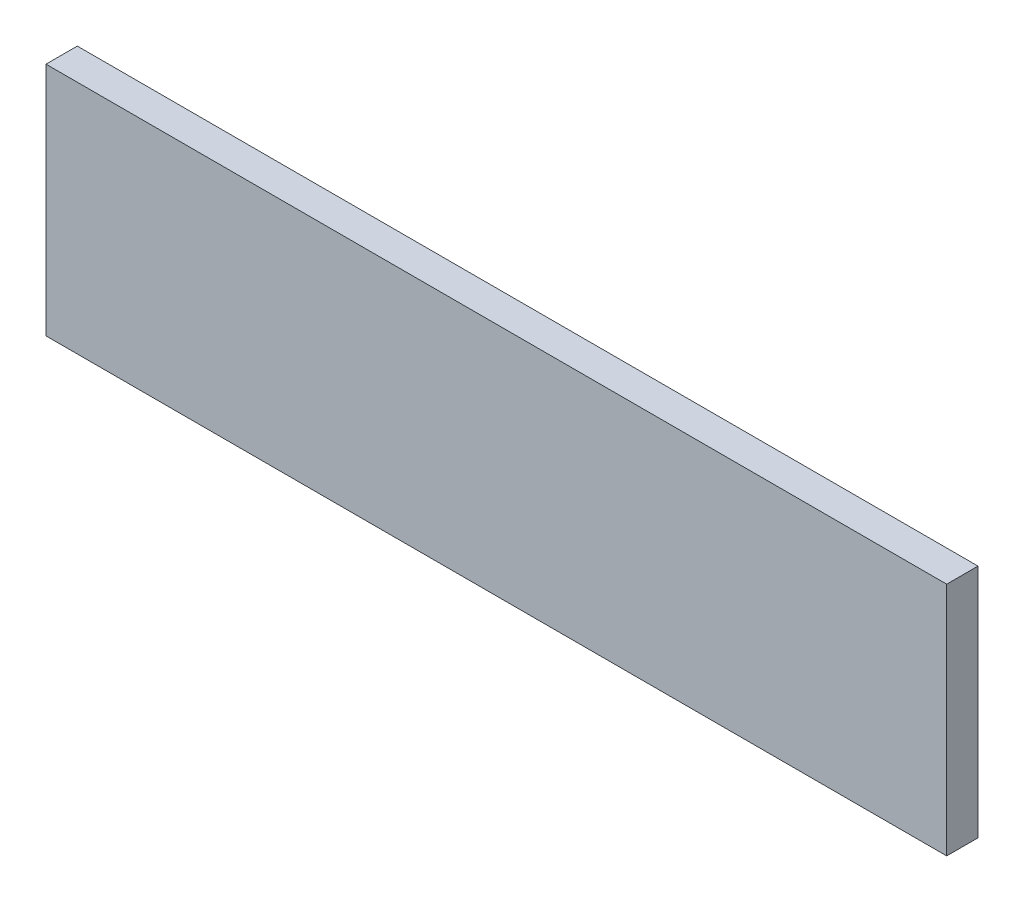
ISO-10303-21;
HEADER;
FILE_DESCRIPTION(('STEP AP214'),'2;1');
FILE_NAME('part.step','',(''),(''),'','','');
FILE_SCHEMA(('AUTOMOTIVE_DESIGN { 1 0 10303 214 1 1 1 1 }'));
ENDSEC;
DATA;
#1=APPLICATION_CONTEXT('core data for automotive mechanical design processes');
#2=APPLICATION_PROTOCOL_DEFINITION('international standard','automotive_design',2000,#1);
#3=PRODUCT_CONTEXT('',#1,'mechanical');
#4=PRODUCT('Part','Part','',(#3));
#5=PRODUCT_RELATED_PRODUCT_CATEGORY('part','',(#4));
#6=PRODUCT_DEFINITION_FORMATION('','',#4);
#7=PRODUCT_DEFINITION_CONTEXT('part definition',#1,'design');
#8=PRODUCT_DEFINITION('design','',#6,#7);
#9=PRODUCT_DEFINITION_SHAPE('','',#8);
#10=(LENGTH_UNIT() NAMED_UNIT(*) SI_UNIT(.MILLI.,.METRE.));
#11=(NAMED_UNIT(*) PLANE_ANGLE_UNIT() SI_UNIT($,.RADIAN.));
#12=(NAMED_UNIT(*) SI_UNIT($,.STERADIAN.) SOLID_ANGLE_UNIT());
#13=UNCERTAINTY_MEASURE_WITH_UNIT(LENGTH_MEASURE(1.E-05),#10,'distance_accuracy_value','');
#14=(GEOMETRIC_REPRESENTATION_CONTEXT(3) GLOBAL_UNCERTAINTY_ASSIGNED_CONTEXT((#13)) GLOBAL_UNIT_ASSIGNED_CONTEXT((#10,
#11,#12)) REPRESENTATION_CONTEXT('',''));
#15=CARTESIAN_POINT('',(0.,0.,0.));
#16=DIRECTION('',(0.,0.,1.));
#17=DIRECTION('',(1.,0.,0.));
#18=AXIS2_PLACEMENT_3D('',#15,#16,#17);
#19=CARTESIAN_POINT('',(-33.7899180327869,21.4653278688525,5.));
#20=DIRECTION('',(1.,0.,0.));
#21=DIRECTION('',(0.,0.,-1.));
#22=AXIS2_PLACEMENT_3D('',#19,#20,#21);
#23=PLANE('',#22);
#24=DIRECTION('',(0.,-1.,0.));
#25=VECTOR('',#24,1.);
#26=CARTESIAN_POINT('',(-33.7899180327869,21.4653278688525,0.));
#27=LINE('',#26,#25);
#28=CARTESIAN_POINT('',(-33.7899180327869,21.4653278688525,0.));
#29=VERTEX_POINT('',#28);
#30=CARTESIAN_POINT('',(-33.7899180327869,-16.1246721311475,0.));
#31=VERTEX_POINT('',#30);
#32=EDGE_CURVE('E98',#29,#31,#27,.T.);
#33=ORIENTED_EDGE('',*,*,#32,.T.);
#34=DIRECTION('',(0.,0.,-1.));
#35=VECTOR('',#34,1.);
#36=CARTESIAN_POINT('',(-33.7899180327869,-16.1246721311475,5.));
#37=LINE('',#36,#35);
#38=CARTESIAN_POINT('',(-33.7899180327869,-16.1246721311475,5.));
#39=VERTEX_POINT('',#38);
#40=EDGE_CURVE('E11',#39,#31,#37,.T.);
#41=ORIENTED_EDGE('',*,*,#40,.F.);
#42=DIRECTION('',(0.,-1.,0.));
#43=VECTOR('',#42,1.);
#44=CARTESIAN_POINT('',(-33.7899180327869,21.4653278688525,5.));
#45=LINE('',#44,#43);
#46=CARTESIAN_POINT('',(-33.7899180327869,21.4653278688525,5.));
#47=VERTEX_POINT('',#46);
#48=EDGE_CURVE('E86',#47,#39,#45,.T.);
#49=ORIENTED_EDGE('',*,*,#48,.F.);
#50=DIRECTION('',(0.,0.,-1.));
#51=VECTOR('',#50,1.);
#52=CARTESIAN_POINT('',(-33.7899180327869,21.4653278688525,5.));
#53=LINE('',#52,#51);
#54=EDGE_CURVE('E94',#47,#29,#53,.T.);
#55=ORIENTED_EDGE('',*,*,#54,.T.);
#56=EDGE_LOOP('',(#33,#41,#49,#55));
#57=FACE_BOUND('',#56,.T.);
#58=ADVANCED_FACE('F35',(#57),#23,.F.);
#59=CARTESIAN_POINT('',(-33.7899180327869,-16.1246721311475,5.));
#60=DIRECTION('',(0.,1.,0.));
#61=DIRECTION('',(0.,0.,1.));
#62=AXIS2_PLACEMENT_3D('',#59,#60,#61);
#63=PLANE('',#62);
#64=DIRECTION('',(1.,0.,0.));
#65=VECTOR('',#64,1.);
#66=CARTESIAN_POINT('',(-33.7899180327869,-16.1246721311475,0.));
#67=LINE('',#66,#65);
#68=CARTESIAN_POINT('',(110.060081967213,-16.1246721311475,0.));
#69=VERTEX_POINT('',#68);
#70=EDGE_CURVE('E90',#31,#69,#67,.T.);
#71=ORIENTED_EDGE('',*,*,#70,.T.);
#72=DIRECTION('',(0.,0.,-1.));
#73=VECTOR('',#72,1.);
#74=CARTESIAN_POINT('',(110.060081967213,-16.1246721311475,5.));
#75=LINE('',#74,#73);
#76=CARTESIAN_POINT('',(110.060081967213,-16.1246721311475,5.));
#77=VERTEX_POINT('',#76);
#78=EDGE_CURVE('E43',#77,#69,#75,.T.);
#79=ORIENTED_EDGE('',*,*,#78,.F.);
#80=DIRECTION('',(1.,0.,0.));
#81=VECTOR('',#80,1.);
#82=CARTESIAN_POINT('',(-33.7899180327869,-16.1246721311475,5.));
#83=LINE('',#82,#81);
#84=EDGE_CURVE('E81',#39,#77,#83,.T.);
#85=ORIENTED_EDGE('',*,*,#84,.F.);
#86=ORIENTED_EDGE('',*,*,#40,.T.);
#87=EDGE_LOOP('',(#71,#79,#85,#86));
#88=FACE_BOUND('',#87,.T.);
#89=ADVANCED_FACE('F89',(#88),#63,.F.);
#90=CARTESIAN_POINT('',(110.060081967213,21.4653278688525,5.));
#91=DIRECTION('',(-1.,0.,0.));
#92=DIRECTION('',(0.,0.,1.));
#93=AXIS2_PLACEMENT_3D('',#90,#91,#92);
#94=PLANE('',#93);
#95=DIRECTION('',(0.,1.,0.));
#96=VECTOR('',#95,1.);
#97=CARTESIAN_POINT('',(110.060081967213,21.4653278688525,0.));
#98=LINE('',#97,#96);
#99=CARTESIAN_POINT('',(110.060081967213,21.4653278688525,0.));
#100=VERTEX_POINT('',#99);
#101=EDGE_CURVE('E68',#69,#100,#98,.T.);
#102=ORIENTED_EDGE('',*,*,#101,.T.);
#103=DIRECTION('',(0.,0.,-1.));
#104=VECTOR('',#103,1.);
#105=CARTESIAN_POINT('',(110.060081967213,21.4653278688525,5.));
#106=LINE('',#105,#104);
#107=CARTESIAN_POINT('',(110.060081967213,21.4653278688525,5.));
#108=VERTEX_POINT('',#107);
#109=EDGE_CURVE('E91',#108,#100,#106,.T.);
#110=ORIENTED_EDGE('',*,*,#109,.F.);
#111=DIRECTION('',(0.,1.,0.));
#112=VECTOR('',#111,1.);
#113=CARTESIAN_POINT('',(110.060081967213,21.4653278688525,5.));
#114=LINE('',#113,#112);
#115=EDGE_CURVE('E84',#77,#108,#114,.T.);
#116=ORIENTED_EDGE('',*,*,#115,.F.);
#117=ORIENTED_EDGE('',*,*,#78,.T.);
#118=EDGE_LOOP('',(#102,#110,#116,#117));
#119=FACE_BOUND('',#118,.T.);
#120=ADVANCED_FACE('F92',(#119),#94,.F.);
#121=CARTESIAN_POINT('',(-33.7899180327869,21.4653278688525,5.));
#122=DIRECTION('',(0.,-1.,0.));
#123=DIRECTION('',(0.,0.,-1.));
#124=AXIS2_PLACEMENT_3D('',#121,#122,#123);
#125=PLANE('',#124);
#126=DIRECTION('',(-1.,0.,0.));
#127=VECTOR('',#126,1.);
#128=CARTESIAN_POINT('',(-33.7899180327869,21.4653278688525,0.));
#129=LINE('',#128,#127);
#130=EDGE_CURVE('E74',#100,#29,#129,.T.);
#131=ORIENTED_EDGE('',*,*,#130,.T.);
#132=ORIENTED_EDGE('',*,*,#54,.F.);
#133=DIRECTION('',(-1.,0.,0.));
#134=VECTOR('',#133,1.);
#135=CARTESIAN_POINT('',(-33.7899180327869,21.4653278688525,5.));
#136=LINE('',#135,#134);
#137=EDGE_CURVE('E51',#108,#47,#136,.T.);
#138=ORIENTED_EDGE('',*,*,#137,.F.);
#139=ORIENTED_EDGE('',*,*,#109,.T.);
#140=EDGE_LOOP('',(#131,#132,#138,#139));
#141=FACE_BOUND('',#140,.T.);
#142=ADVANCED_FACE('F105',(#141),#125,.F.);
#143=CARTESIAN_POINT('',(0.,0.,5.));
#144=DIRECTION('',(0.,0.,1.));
#145=DIRECTION('',(1.,0.,0.));
#146=AXIS2_PLACEMENT_3D('',#143,#144,#145);
#147=PLANE('',#146);
#148=ORIENTED_EDGE('',*,*,#48,.T.);
#149=ORIENTED_EDGE('',*,*,#84,.T.);
#150=ORIENTED_EDGE('',*,*,#115,.T.);
#151=ORIENTED_EDGE('',*,*,#137,.T.);
#152=EDGE_LOOP('',(#148,#149,#150,#151));
#153=FACE_BOUND('',#152,.T.);
#154=ADVANCED_FACE('F82',(#153),#147,.T.);
#155=CARTESIAN_POINT('',(0.,0.,0.));
#156=DIRECTION('',(0.,0.,1.));
#157=DIRECTION('',(1.,0.,0.));
#158=AXIS2_PLACEMENT_3D('',#155,#156,#157);
#159=PLANE('',#158);
#160=ORIENTED_EDGE('',*,*,#32,.F.);
#161=ORIENTED_EDGE('',*,*,#130,.F.);
#162=ORIENTED_EDGE('',*,*,#101,.F.);
#163=ORIENTED_EDGE('',*,*,#70,.F.);
#164=EDGE_LOOP('',(#160,#161,#162,#163));
#165=FACE_BOUND('',#164,.T.);
#166=ADVANCED_FACE('F108',(#165),#159,.F.);
#167=CLOSED_SHELL('',(#58,#89,#120,#142,#154,#166));
#168=MANIFOLD_SOLID_BREP('B2',#167);
#169=ADVANCED_BREP_SHAPE_REPRESENTATION('',(#18,#168),#14);
#170=SHAPE_DEFINITION_REPRESENTATION(#9,#169);
ENDSEC;
END-ISO-10303-21;
